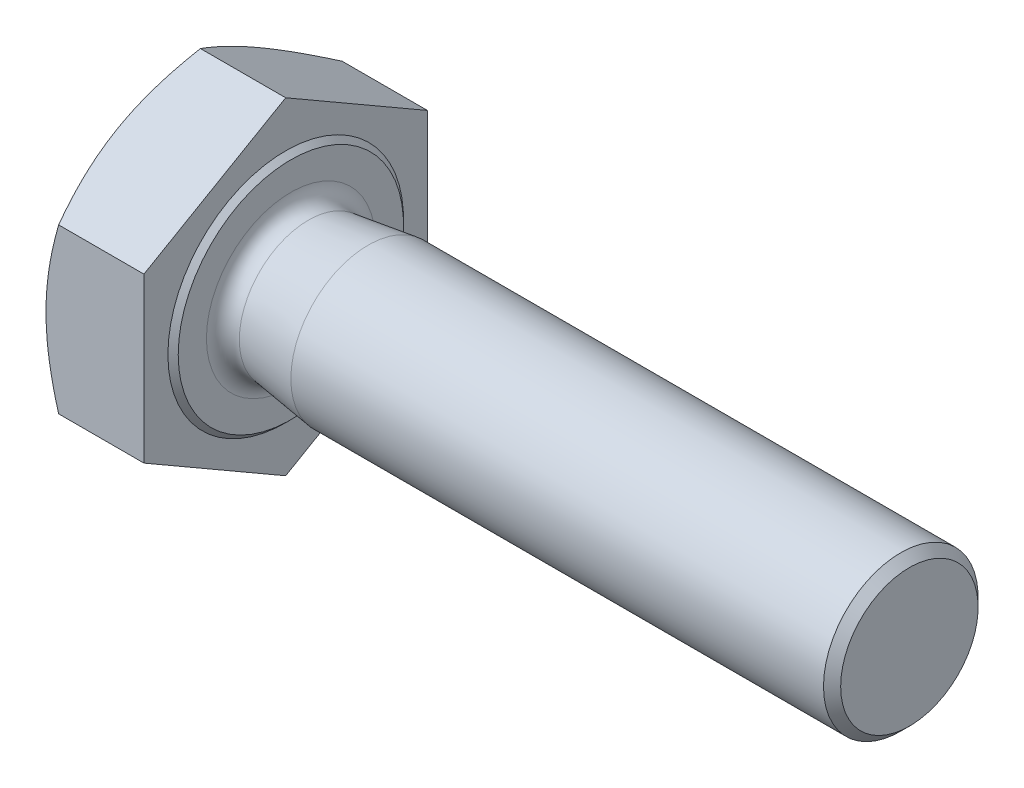
ISO-10303-21;
HEADER;
FILE_DESCRIPTION(('STEP AP214'),'2;1');
FILE_NAME('part.step','',(''),(''),'','','');
FILE_SCHEMA(('AUTOMOTIVE_DESIGN { 1 0 10303 214 1 1 1 1 }'));
ENDSEC;
DATA;
#1=APPLICATION_CONTEXT('core data for automotive mechanical design processes');
#2=APPLICATION_PROTOCOL_DEFINITION('international standard','automotive_design',2000,#1);
#3=PRODUCT_CONTEXT('',#1,'mechanical');
#4=PRODUCT('Part','Part','',(#3));
#5=PRODUCT_RELATED_PRODUCT_CATEGORY('part','',(#4));
#6=PRODUCT_DEFINITION_FORMATION('','',#4);
#7=PRODUCT_DEFINITION_CONTEXT('part definition',#1,'design');
#8=PRODUCT_DEFINITION('design','',#6,#7);
#9=PRODUCT_DEFINITION_SHAPE('','',#8);
#10=(LENGTH_UNIT() NAMED_UNIT(*) SI_UNIT(.MILLI.,.METRE.));
#11=(NAMED_UNIT(*) PLANE_ANGLE_UNIT() SI_UNIT($,.RADIAN.));
#12=(NAMED_UNIT(*) SI_UNIT($,.STERADIAN.) SOLID_ANGLE_UNIT());
#13=UNCERTAINTY_MEASURE_WITH_UNIT(LENGTH_MEASURE(1.E-05),#10,'distance_accuracy_value','');
#14=(GEOMETRIC_REPRESENTATION_CONTEXT(3) GLOBAL_UNCERTAINTY_ASSIGNED_CONTEXT((#13)) GLOBAL_UNIT_ASSIGNED_CONTEXT((#10,
#11,#12)) REPRESENTATION_CONTEXT('',''));
#15=CARTESIAN_POINT('',(0.,0.,0.));
#16=DIRECTION('',(0.,0.,1.));
#17=DIRECTION('',(1.,0.,0.));
#18=AXIS2_PLACEMENT_3D('',#15,#16,#17);
#19=CARTESIAN_POINT('',(2.00000000000001,1.58771324027147,-2.75));
#20=DIRECTION('',(1.,0.,0.));
#21=DIRECTION('',(0.,0.,-1.));
#22=AXIS2_PLACEMENT_3D('',#19,#20,#21);
#23=PLANE('',#22);
#24=CARTESIAN_POINT('',(2.00000000000001,0.,0.));
#25=DIRECTION('',(-1.,0.,0.));
#26=DIRECTION('',(0.,0.,1.));
#27=AXIS2_PLACEMENT_3D('',#24,#25,#26);
#28=CIRCLE('',#27,1.637625);
#29=CARTESIAN_POINT('',(2.00000000000001,0.,1.637625));
#30=VERTEX_POINT('',#29);
#31=EDGE_CURVE('E174',#30,#30,#28,.T.);
#32=ORIENTED_EDGE('',*,*,#31,.T.);
#33=EDGE_LOOP('',(#32));
#34=FACE_BOUND('',#33,.T.);
#35=CARTESIAN_POINT('',(2.00000000000001,0.,0.));
#36=DIRECTION('',(-1.,0.,0.));
#37=DIRECTION('',(0.,0.,1.));
#38=AXIS2_PLACEMENT_3D('',#35,#36,#37);
#39=CIRCLE('',#38,2.185);
#40=CARTESIAN_POINT('',(2.00000000000001,0.,2.185));
#41=VERTEX_POINT('',#40);
#42=EDGE_CURVE('E252',#41,#41,#39,.T.);
#43=ORIENTED_EDGE('',*,*,#42,.F.);
#44=EDGE_LOOP('',(#43));
#45=FACE_BOUND('',#44,.T.);
#46=ADVANCED_FACE('F34',(#34,#45),#23,.T.);
#47=CARTESIAN_POINT('',(3.5,0.,0.));
#48=DIRECTION('',(1.,0.,0.));
#49=DIRECTION('',(0.,0.,-1.));
#50=AXIS2_PLACEMENT_3D('',#47,#48,#49);
#51=CONICAL_SURFACE('',#50,1.5,0.136810520597756);
#52=CARTESIAN_POINT('',(2.34091524101158,0.,0.));
#53=DIRECTION('',(-1.,0.,0.));
#54=DIRECTION('',(0.,0.,1.));
#55=AXIS2_PLACEMENT_3D('',#52,#53,#54);
#56=CIRCLE('',#55,1.3404281913816);
#57=CARTESIAN_POINT('',(2.34091524101158,0.,1.3404281913816));
#58=VERTEX_POINT('',#57);
#59=EDGE_CURVE('E118',#58,#58,#56,.T.);
#60=ORIENTED_EDGE('',*,*,#59,.F.);
#61=EDGE_LOOP('',(#60));
#62=FACE_BOUND('',#61,.T.);
#63=CARTESIAN_POINT('',(3.5,0.,0.));
#64=DIRECTION('',(-1.,0.,0.));
#65=DIRECTION('',(0.,0.,1.));
#66=AXIS2_PLACEMENT_3D('',#63,#64,#65);
#67=CIRCLE('',#66,1.5);
#68=CARTESIAN_POINT('',(3.5,0.,1.5));
#69=VERTEX_POINT('',#68);
#70=EDGE_CURVE('E171',#69,#69,#67,.T.);
#71=ORIENTED_EDGE('',*,*,#70,.T.);
#72=EDGE_LOOP('',(#71));
#73=FACE_BOUND('',#72,.T.);
#74=ADVANCED_FACE('F167',(#62,#73),#51,.T.);
#75=CARTESIAN_POINT('',(2.00000000000001,0.,0.));
#76=DIRECTION('',(-1.,0.,0.));
#77=DIRECTION('',(0.,0.,1.));
#78=AXIS2_PLACEMENT_3D('',#75,#76,#77);
#79=CYLINDRICAL_SURFACE('',#78,1.5);
#80=CARTESIAN_POINT('',(13.8333333333333,0.,0.));
#81=DIRECTION('',(-1.,0.,0.));
#82=DIRECTION('',(0.,0.,1.));
#83=AXIS2_PLACEMENT_3D('',#80,#81,#82);
#84=CIRCLE('',#83,1.5);
#85=CARTESIAN_POINT('',(13.8333333333333,0.,1.5));
#86=VERTEX_POINT('',#85);
#87=EDGE_CURVE('E152',#86,#86,#84,.T.);
#88=ORIENTED_EDGE('',*,*,#87,.T.);
#89=EDGE_LOOP('',(#88));
#90=FACE_BOUND('',#89,.T.);
#91=ORIENTED_EDGE('',*,*,#70,.F.);
#92=EDGE_LOOP('',(#91));
#93=FACE_BOUND('',#92,.T.);
#94=ADVANCED_FACE('F164',(#90,#93),#79,.T.);
#95=CARTESIAN_POINT('',(14.,1.5,0.));
#96=DIRECTION('',(-1.,0.,0.));
#97=DIRECTION('',(0.,0.,1.));
#98=AXIS2_PLACEMENT_3D('',#95,#96,#97);
#99=PLANE('',#98);
#100=CARTESIAN_POINT('',(14.,0.,0.));
#101=DIRECTION('',(-1.,0.,0.));
#102=DIRECTION('',(0.,0.,1.));
#103=AXIS2_PLACEMENT_3D('',#100,#101,#102);
#104=CIRCLE('',#103,1.33333333333333);
#105=CARTESIAN_POINT('',(14.,0.,1.33333333333333));
#106=VERTEX_POINT('',#105);
#107=EDGE_CURVE('E42',#106,#106,#104,.F.);
#108=ORIENTED_EDGE('',*,*,#107,.T.);
#109=EDGE_LOOP('',(#108));
#110=FACE_BOUND('',#109,.T.);
#111=ADVANCED_FACE('F157',(#110),#99,.F.);
#112=CARTESIAN_POINT('',(2.3,0.,0.));
#113=DIRECTION('',(-1.,0.,0.));
#114=DIRECTION('',(0.,0.,1.));
#115=AXIS2_PLACEMENT_3D('',#112,#113,#114);
#116=TOROIDAL_SURFACE('',#115,1.637625,0.299999999999995);
#117=ORIENTED_EDGE('',*,*,#31,.F.);
#118=EDGE_LOOP('',(#117));
#119=FACE_BOUND('',#118,.T.);
#120=ORIENTED_EDGE('',*,*,#59,.T.);
#121=EDGE_LOOP('',(#120));
#122=FACE_BOUND('',#121,.T.);
#123=ADVANCED_FACE('F161',(#119,#122),#116,.F.);
#124=CARTESIAN_POINT('',(13.8333333333333,0.,0.));
#125=DIRECTION('',(-1.,0.,0.));
#126=DIRECTION('',(0.,0.,1.));
#127=AXIS2_PLACEMENT_3D('',#124,#125,#126);
#128=CONICAL_SURFACE('',#127,1.5,0.785398163397443);
#129=ORIENTED_EDGE('',*,*,#107,.F.);
#130=EDGE_LOOP('',(#129));
#131=FACE_BOUND('',#130,.T.);
#132=ORIENTED_EDGE('',*,*,#87,.F.);
#133=EDGE_LOOP('',(#132));
#134=FACE_BOUND('',#133,.T.);
#135=ADVANCED_FACE('F36',(#131,#134),#128,.T.);
#136=CARTESIAN_POINT('',(1.90000000000001,-2.285,0.));
#137=DIRECTION('',(1.,0.,0.));
#138=DIRECTION('',(0.,0.,-1.));
#139=AXIS2_PLACEMENT_3D('',#136,#137,#138);
#140=PLANE('',#139);
#141=CARTESIAN_POINT('',(1.90000000000001,0.,0.));
#142=DIRECTION('',(-1.,0.,0.));
#143=DIRECTION('',(0.,0.,1.));
#144=AXIS2_PLACEMENT_3D('',#141,#142,#143);
#145=CIRCLE('',#144,2.285);
#146=CARTESIAN_POINT('',(1.90000000000001,0.,2.285));
#147=VERTEX_POINT('',#146);
#148=EDGE_CURVE('E254',#147,#147,#145,.T.);
#149=ORIENTED_EDGE('',*,*,#148,.T.);
#150=EDGE_LOOP('',(#149));
#151=FACE_BOUND('',#150,.T.);
#152=DIRECTION('',(0.,1.,0.));
#153=VECTOR('',#152,1.);
#154=CARTESIAN_POINT('',(1.90000000000001,-1.58771324027151,-2.75));
#155=LINE('',#154,#153);
#156=CARTESIAN_POINT('',(1.90000000000001,-1.5877132402715,-2.75));
#157=VERTEX_POINT('',#156);
#158=CARTESIAN_POINT('',(1.90000000000001,1.58771324027147,-2.75));
#159=VERTEX_POINT('',#158);
#160=EDGE_CURVE('E105',#157,#159,#155,.T.);
#161=ORIENTED_EDGE('',*,*,#160,.T.);
#162=DIRECTION('',(0.,0.500000000000002,0.866025403784437));
#163=VECTOR('',#162,1.);
#164=CARTESIAN_POINT('',(1.90000000000001,1.58771324027147,-2.75));
#165=LINE('',#164,#163);
#166=CARTESIAN_POINT('',(1.90000000000001,3.17542648054295,0.));
#167=VERTEX_POINT('',#166);
#168=EDGE_CURVE('E119',#159,#167,#165,.T.);
#169=ORIENTED_EDGE('',*,*,#168,.T.);
#170=DIRECTION('',(0.,-0.499999999999997,0.866025403784441));
#171=VECTOR('',#170,1.);
#172=CARTESIAN_POINT('',(1.90000000000001,3.17542648054295,0.));
#173=LINE('',#172,#171);
#174=CARTESIAN_POINT('',(1.90000000000001,1.58771324027149,2.75));
#175=VERTEX_POINT('',#174);
#176=EDGE_CURVE('E262',#167,#175,#173,.T.);
#177=ORIENTED_EDGE('',*,*,#176,.T.);
#178=DIRECTION('',(0.,-1.,0.));
#179=VECTOR('',#178,1.);
#180=CARTESIAN_POINT('',(1.90000000000001,1.58771324027149,2.75));
#181=LINE('',#180,#179);
#182=CARTESIAN_POINT('',(1.90000000000001,-1.58771324027148,2.75000000000001));
#183=VERTEX_POINT('',#182);
#184=EDGE_CURVE('E260',#175,#183,#181,.T.);
#185=ORIENTED_EDGE('',*,*,#184,.T.);
#186=DIRECTION('',(0.,-0.500000000000001,-0.866025403784438));
#187=VECTOR('',#186,1.);
#188=CARTESIAN_POINT('',(1.90000000000001,-1.58771324027148,2.75000000000001));
#189=LINE('',#188,#187);
#190=CARTESIAN_POINT('',(1.90000000000001,-3.17542648054296,0.));
#191=VERTEX_POINT('',#190);
#192=EDGE_CURVE('E48',#183,#191,#189,.T.);
#193=ORIENTED_EDGE('',*,*,#192,.T.);
#194=DIRECTION('',(0.,0.499999999999998,-0.86602540378444));
#195=VECTOR('',#194,1.);
#196=CARTESIAN_POINT('',(1.90000000000001,-3.17542648054296,0.));
#197=LINE('',#196,#195);
#198=EDGE_CURVE('E11',#191,#157,#197,.T.);
#199=ORIENTED_EDGE('',*,*,#198,.T.);
#200=EDGE_LOOP('',(#161,#169,#177,#185,#193,#199));
#201=FACE_BOUND('',#200,.T.);
#202=ADVANCED_FACE('F104',(#151,#201),#140,.T.);
#203=CARTESIAN_POINT('',(1.90000000000001,0.,0.));
#204=DIRECTION('',(-1.,0.,0.));
#205=DIRECTION('',(0.,0.,1.));
#206=AXIS2_PLACEMENT_3D('',#203,#204,#205);
#207=CONICAL_SURFACE('',#206,2.285,0.785398163397448);
#208=ORIENTED_EDGE('',*,*,#42,.T.);
#209=EDGE_LOOP('',(#208));
#210=FACE_BOUND('',#209,.T.);
#211=ORIENTED_EDGE('',*,*,#148,.F.);
#212=EDGE_LOOP('',(#211));
#213=FACE_BOUND('',#212,.T.);
#214=ADVANCED_FACE('F277',(#210,#213),#207,.T.);
#215=CARTESIAN_POINT('',(0.,1.58771324027147,-2.75));
#216=DIRECTION('',(1.,0.,0.));
#217=DIRECTION('',(0.,0.,-1.));
#218=AXIS2_PLACEMENT_3D('',#215,#216,#217);
#219=PLANE('',#218);
#220=CARTESIAN_POINT('',(0.,0.,0.));
#221=DIRECTION('',(1.,0.,0.));
#222=DIRECTION('',(0.,0.,-1.));
#223=AXIS2_PLACEMENT_3D('',#220,#221,#222);
#224=CIRCLE('',#223,2.75);
#225=CARTESIAN_POINT('',(0.,0.,-2.75));
#226=VERTEX_POINT('',#225);
#227=CARTESIAN_POINT('',(0.,2.3815698604072,-1.37500000000001));
#228=VERTEX_POINT('',#227);
#229=EDGE_CURVE('E151',#226,#228,#224,.T.);
#230=ORIENTED_EDGE('',*,*,#229,.F.);
#231=CARTESIAN_POINT('',(0.,-2.38156986040723,-1.37500000000001));
#232=VERTEX_POINT('',#231);
#233=EDGE_CURVE('E147',#232,#226,#224,.T.);
#234=ORIENTED_EDGE('',*,*,#233,.F.);
#235=CARTESIAN_POINT('',(0.,-2.38156986040721,1.375));
#236=VERTEX_POINT('',#235);
#237=EDGE_CURVE('E150',#236,#232,#224,.T.);
#238=ORIENTED_EDGE('',*,*,#237,.F.);
#239=CARTESIAN_POINT('',(0.,0.,2.75));
#240=VERTEX_POINT('',#239);
#241=EDGE_CURVE('E318',#240,#236,#224,.T.);
#242=ORIENTED_EDGE('',*,*,#241,.F.);
#243=CARTESIAN_POINT('',(0.,0.,0.));
#244=DIRECTION('',(-1.,0.,0.));
#245=DIRECTION('',(0.,0.,1.));
#246=AXIS2_PLACEMENT_3D('',#243,#244,#245);
#247=CIRCLE('',#246,2.75);
#248=CARTESIAN_POINT('',(0.,2.38156986040721,1.37499999999999));
#249=VERTEX_POINT('',#248);
#250=EDGE_CURVE('E173',#240,#249,#247,.T.);
#251=ORIENTED_EDGE('',*,*,#250,.T.);
#252=EDGE_CURVE('E295',#228,#249,#224,.T.);
#253=ORIENTED_EDGE('',*,*,#252,.F.);
#254=EDGE_LOOP('',(#230,#234,#238,#242,#251,#253));
#255=FACE_BOUND('',#254,.T.);
#256=ADVANCED_FACE('F280',(#255),#219,.F.);
#257=CARTESIAN_POINT('',(0.,0.,0.));
#258=DIRECTION('',(1.,0.,0.));
#259=DIRECTION('',(0.,0.,1.));
#260=AXIS2_PLACEMENT_3D('',#257,#258,#259);
#261=CONICAL_SURFACE('',#260,2.75,1.0471975511966);
#262=CARTESIAN_POINT('',(0.245686763364765,3.17554195059679,0.000199999999996788));
#263=CARTESIAN_POINT('',(0.205387662249268,3.10576962051744,-0.120649220659909));
#264=CARTESIAN_POINT('',(0.168736902597667,3.03539502097909,-0.242541602622638));
#265=CARTESIAN_POINT('',(0.104762182969805,2.8934271739444,-0.488437126727897));
#266=CARTESIAN_POINT('',(0.0774608556745015,2.82183140359859,-0.61244463857386));
#267=CARTESIAN_POINT('',(0.0349617452941205,2.67952717191843,-0.858922797975949));
#268=CARTESIAN_POINT('',(0.0194811186224612,2.60884060771578,-0.981355518587423));
#269=CARTESIAN_POINT('',(0.000999397369943601,2.46713482015519,-1.22679714236892));
#270=CARTESIAN_POINT('',(-0.0020170005373972,2.39611611197038,-1.34980515323292));
#271=CARTESIAN_POINT('',(0.00425314542854959,2.26341005486545,-1.5796587866108));
#272=CARTESIAN_POINT('',(0.0120001542767051,2.20170285541369,-1.68653879125403));
#273=CARTESIAN_POINT('',(0.036555181064357,2.07869048467395,-1.89960246733476));
#274=CARTESIAN_POINT('',(0.0533715896505722,2.01738573896434,-2.00578540164889));
#275=CARTESIAN_POINT('',(0.0954119223459576,1.89411967378235,-2.21928848939319));
#276=CARTESIAN_POINT('',(0.120814080687232,1.83217395817123,-2.32658161614286));
#277=CARTESIAN_POINT('',(0.178467225839982,1.70920651275308,-2.53956747928406));
#278=CARTESIAN_POINT('',(0.210704663298983,1.64818320715446,-2.64526294502666));
#279=CARTESIAN_POINT('',(0.24568676336476,1.58759777021764,-2.7502));
#280=B_SPLINE_CURVE_WITH_KNOTS('',3,(#262,#263,#264,#265,#266,#267,#268,#269,#270,#271,#272,
#273,#274,#275,#276,#277,#278,#279),.UNSPECIFIED.,.F.,.F.,(4,2,2,2,2,2,2,2,4),(0.,
0.43591282872589,0.872873557116336,1.29901931904672,1.72464171213574,2.09526089052938,
2.46622354066375,2.84541551798558,3.22386274754525),.UNSPECIFIED.);
#281=CARTESIAN_POINT('',(0.245620093061862,1.58771324027147,-2.75));
#282=VERTEX_POINT('',#281);
#283=EDGE_CURVE('E225',#228,#282,#280,.T.);
#284=ORIENTED_EDGE('',*,*,#283,.T.);
#285=CARTESIAN_POINT('',(1.31624212326251,-4.21145702342949,-2.74999999999999));
#286=CARTESIAN_POINT('',(1.25788881046744,-4.09071174042553,-2.74999999999999));
#287=CARTESIAN_POINT('',(1.20011539171992,-3.96968104448539,-2.74999999999999));
#288=CARTESIAN_POINT('',(1.08605969966697,-3.7268945072172,-2.74999999999999));
#289=CARTESIAN_POINT('',(1.02977768439379,-3.60513854481436,-2.74999999999999));
#290=CARTESIAN_POINT('',(0.91873979244787,-3.3600897390939,-2.74999999999999));
#291=CARTESIAN_POINT('',(0.863994486657983,-3.23679208848354,-2.74999999999999));
#292=CARTESIAN_POINT('',(0.756854443318355,-2.98918361342532,-2.74999999999999));
#293=CARTESIAN_POINT('',(0.704459583295894,-2.86487284216706,-2.74999999999999));
#294=CARTESIAN_POINT('',(0.602022235339522,-2.6134943668471,-2.74999999999999));
#295=CARTESIAN_POINT('',(0.55201660745802,-2.48641155941057,-2.74999999999999));
#296=CARTESIAN_POINT('',(0.455920265276003,-2.23074720807679,-2.74999999999999));
#297=CARTESIAN_POINT('',(0.409829986462912,-2.10216549926727,-2.74999999999999));
#298=CARTESIAN_POINT('',(0.322802331663269,-1.84356266872548,-2.75));
#299=CARTESIAN_POINT('',(0.281854005910036,-1.71354526995044,-2.75));
#300=CARTESIAN_POINT('',(0.206439732743099,-1.45166207558676,-2.75));
#301=CARTESIAN_POINT('',(0.171971735991313,-1.31979687856831,-2.75));
#302=CARTESIAN_POINT('',(0.111191121809896,-1.05412827285572,-2.75));
#303=CARTESIAN_POINT('',(0.0848806435176731,-0.920324365387682,-2.75));
#304=CARTESIAN_POINT('',(0.0421860185817315,-0.651102654150332,-2.75));
#305=CARTESIAN_POINT('',(0.0258018800461315,-0.515684849062829,-2.75));
#306=CARTESIAN_POINT('',(0.00440934209633706,-0.244802002252751,-2.75));
#307=CARTESIAN_POINT('',(-0.000671138197587251,-0.109342801148255,-2.75));
#308=CARTESIAN_POINT('',(0.000813817391959725,0.16148175402296,-2.75));
#309=CARTESIAN_POINT('',(0.00737622709449395,0.296847123330022,-2.75));
#310=CARTESIAN_POINT('',(0.0280606058300816,0.52798398747936,-2.75));
#311=CARTESIAN_POINT('',(0.0394847950613384,0.624010438507003,-2.75));
#312=CARTESIAN_POINT('',(0.0674495513434205,0.815321973782276,-2.75));
#313=CARTESIAN_POINT('',(0.0839909247880751,0.910606938754643,-2.75));
#314=CARTESIAN_POINT('',(0.140422744319285,1.19527171090509,-2.75));
#315=CARTESIAN_POINT('',(0.18710637361392,1.38331767236712,-2.75));
#316=CARTESIAN_POINT('',(0.267628179855785,1.66470103563901,-2.75));
#317=CARTESIAN_POINT('',(0.296628866845756,1.7595050183921,-2.75));
#318=CARTESIAN_POINT('',(0.357501164220875,1.9481235007387,-2.75));
#319=CARTESIAN_POINT('',(0.389370794921845,2.04193863349427,-2.75));
#320=CARTESIAN_POINT('',(0.455317725722647,2.22818711914583,-2.75));
#321=CARTESIAN_POINT('',(0.489381592159885,2.32062527709228,-2.75));
#322=CARTESIAN_POINT('',(0.559509524426167,2.50478428633537,-2.75));
#323=CARTESIAN_POINT('',(0.595574398155265,2.59650483059226,-2.75));
#324=CARTESIAN_POINT('',(0.632442341458888,2.68789367744809,-2.75));
#325=B_SPLINE_CURVE_WITH_KNOTS('',3,(#285,#286,#287,#288,#289,#290,#291,#292,#293,#294,#295,
#296,#297,#298,#299,#300,#301,#302,#303,#304,#305,#306,#307,#308,#309,#310,#311,#312,#313,#314,
#315,#316,#317,#318,#319,#320,#321,#322,#323,#324),.UNSPECIFIED.,.F.,.F.,(4,2,2,2,2,2,2,2,2,2,2,
2,2,2,2,2,2,2,2,4),(0.,0.402324664004668,0.804718486862624,1.20941398617469,1.61408837380394,
2.0237401516388,2.43343743378258,2.84224691340594,3.25092689293203,3.65971394971315,
4.06850134040281,4.47467442318479,4.88074195028635,5.17071124524431,5.46072625844401,
6.04118769843149,6.3385855190861,6.63577967395433,6.93130128400769,7.2269430906841),.UNSPECIFIED.);
#326=EDGE_CURVE('E297',#282,#226,#325,.F.);
#327=ORIENTED_EDGE('',*,*,#326,.T.);
#328=ORIENTED_EDGE('',*,*,#229,.T.);
#329=EDGE_LOOP('',(#284,#327,#328));
#330=FACE_BOUND('',#329,.T.);
#331=ADVANCED_FACE('F284',(#330),#261,.T.);
#332=CARTESIAN_POINT('',(0.245686763364766,1.58759777021766,2.7502));
#333=CARTESIAN_POINT('',(0.205387662249269,1.65737010029701,2.6293507793401));
#334=CARTESIAN_POINT('',(0.168736902597668,1.72774469983535,2.50745839737737));
#335=CARTESIAN_POINT('',(0.104762182969807,1.86971254687005,2.26156287327211));
#336=CARTESIAN_POINT('',(0.0774608556745038,1.94130831721585,2.13755536142614));
#337=CARTESIAN_POINT('',(0.0349617452941234,2.08361254889601,1.89107720202405));
#338=CARTESIAN_POINT('',(0.0194811186224643,2.15429911309866,1.76864448141258));
#339=CARTESIAN_POINT('',(0.000999397369947196,2.29600490065925,1.52320285763108));
#340=CARTESIAN_POINT('',(-0.00201700053739325,2.36702360884406,1.40019484676708));
#341=CARTESIAN_POINT('',(0.00425314542855422,2.49972966594899,1.1703412133892));
#342=CARTESIAN_POINT('',(0.01200015427671,2.56143686540075,1.06346120874597));
#343=CARTESIAN_POINT('',(0.0365551810643623,2.68444923614048,0.850397532665244));
#344=CARTESIAN_POINT('',(0.0533715896505777,2.7457539818501,0.744214598351105));
#345=CARTESIAN_POINT('',(0.0954119223459633,2.86902004703208,0.530711510606811));
#346=CARTESIAN_POINT('',(0.120814080687238,2.9309657626432,0.42341838385714));
#347=CARTESIAN_POINT('',(0.178467225839988,3.05393320806135,0.210432520715945));
#348=CARTESIAN_POINT('',(0.210704663298988,3.11495651365996,0.104737054973343));
#349=CARTESIAN_POINT('',(0.245686763364765,3.17554195059679,-0.000200000000003531));
#350=B_SPLINE_CURVE_WITH_KNOTS('',3,(#332,#333,#334,#335,#336,#337,#338,#339,#340,#341,#342,
#343,#344,#345,#346,#347,#348,#349),.UNSPECIFIED.,.F.,.F.,(4,2,2,2,2,2,2,2,4),(0.,
0.43591282872589,0.872873557116336,1.29901931904672,1.72464171213574,2.09526089052938,
2.46622354066375,2.84541551798557,3.22386274754524),.UNSPECIFIED.);
#351=CARTESIAN_POINT('',(0.245620093061867,3.17542648054295,0.));
#352=VERTEX_POINT('',#351);
#353=EDGE_CURVE('E131',#249,#352,#350,.T.);
#354=ORIENTED_EDGE('',*,*,#353,.T.);
#355=EDGE_CURVE('E56',#352,#228,#280,.T.);
#356=ORIENTED_EDGE('',*,*,#355,.T.);
#357=ORIENTED_EDGE('',*,*,#252,.T.);
#358=EDGE_LOOP('',(#354,#356,#357));
#359=FACE_BOUND('',#358,.T.);
#360=ADVANCED_FACE('F205',(#359),#261,.T.);
#361=CARTESIAN_POINT('',(0.245620093061868,1.58771324027149,2.75));
#362=VERTEX_POINT('',#361);
#363=EDGE_CURVE('E127',#362,#249,#350,.T.);
#364=ORIENTED_EDGE('',*,*,#363,.T.);
#365=ORIENTED_EDGE('',*,*,#250,.F.);
#366=CARTESIAN_POINT('',(1.31624249788294,-4.21145779837337,2.75000000000002));
#367=CARTESIAN_POINT('',(1.25788916905969,-4.09071248884133,2.75000000000001));
#368=CARTESIAN_POINT('',(1.20011573429342,-3.96968176635284,2.75000000000001));
#369=CARTESIAN_POINT('',(1.08606001028829,-3.72689517589921,2.75000000000001));
#370=CARTESIAN_POINT('',(1.02977797908169,-3.60513918685926,2.75000000000001));
#371=CARTESIAN_POINT('',(0.918740055260961,-3.36009032741943,2.75000000000001));
#372=CARTESIAN_POINT('',(0.863994733533081,-3.23679264972493,2.75000000000001));
#373=CARTESIAN_POINT('',(0.756854658610672,-2.98918412029702,2.75000000000001));
#374=CARTESIAN_POINT('',(0.704459782943393,-2.86487332175325,2.75000000000001));
#375=CARTESIAN_POINT('',(0.602022403965373,-2.61349479112549,2.75000000000001));
#376=CARTESIAN_POINT('',(0.552016760715457,-2.48641195566195,2.75000000000001));
#377=CARTESIAN_POINT('',(0.455920388648755,-2.23074754780518,2.75000000000001));
#378=CARTESIAN_POINT('',(0.409830095319694,-2.10216581049953,2.75000000000001));
#379=CARTESIAN_POINT('',(0.322802412932949,-1.84356292242721,2.75000000000001));
#380=CARTESIAN_POINT('',(0.281854074103877,-1.71354549461973,2.75000000000001));
#381=CARTESIAN_POINT('',(0.206439776997205,-1.45166224139211,2.75000000000001));
#382=CARTESIAN_POINT('',(0.171971769380086,-1.31979701454263,2.75000000000001));
#383=CARTESIAN_POINT('',(0.111191133215989,-1.05412833266647,2.75000000000001));
#384=CARTESIAN_POINT('',(0.0848806447633858,-0.920324378642731,2.75000000000001));
#385=CARTESIAN_POINT('',(0.0421860066064337,-0.651102573247699,2.75000000000001));
#386=CARTESIAN_POINT('',(0.0258018650051084,-0.515684720559049,2.75000000000001));
#387=CARTESIAN_POINT('',(0.00440932930341746,-0.244801778776636,2.75000000000001));
#388=CARTESIAN_POINT('',(-0.000671145746831288,-0.109342530304086,2.75000000000001));
#389=CARTESIAN_POINT('',(0.000813828419927892,0.161482118797624,2.75000000000001));
#390=CARTESIAN_POINT('',(0.00737625145778912,0.296847534667326,2.75000000000001));
#391=CARTESIAN_POINT('',(0.0280606568921305,0.527984458346977,2.75));
#392=CARTESIAN_POINT('',(0.0394848568087034,0.624010922860067,2.75));
#393=CARTESIAN_POINT('',(0.0674496350497989,0.815322484539504,2.75));
#394=CARTESIAN_POINT('',(0.0839910197682492,0.910607462430497,2.75));
#395=CARTESIAN_POINT('',(0.140422873394751,1.19527227271464,2.75));
#396=CARTESIAN_POINT('',(0.187106525762279,1.38331825868885,2.75));
#397=CARTESIAN_POINT('',(0.267628366134444,1.66470165859646,2.75));
#398=CARTESIAN_POINT('',(0.296629064583484,1.75950565376436,2.75));
#399=CARTESIAN_POINT('',(0.357501384545932,1.94812416079951,2.75));
#400=CARTESIAN_POINT('',(0.38937102637501,2.04193930582903,2.75));
#401=CARTESIAN_POINT('',(0.45531797899608,2.2281878158503,2.75));
#402=CARTESIAN_POINT('',(0.489381856125789,2.32062598589335,2.75));
#403=CARTESIAN_POINT('',(0.559509809454751,2.50478501935609,2.75));
#404=CARTESIAN_POINT('',(0.5955746935544,2.59650557573584,2.75));
#405=CARTESIAN_POINT('',(0.632442647069142,2.68789443473504,2.75));
#406=B_SPLINE_CURVE_WITH_KNOTS('',3,(#366,#367,#368,#369,#370,#371,#372,#373,#374,#375,#376,
#377,#378,#379,#380,#381,#382,#383,#384,#385,#386,#387,#388,#389,#390,#391,#392,#393,#394,#395,
#396,#397,#398,#399,#400,#401,#402,#403,#404,#405),.UNSPECIFIED.,.F.,.F.,(4,2,2,2,2,2,2,2,2,2,2,
2,2,2,2,2,2,2,2,4),(0.,0.402324756583367,0.804718672035376,1.20941426501205,1.61408874629842,
2.02374061924835,2.43343799653934,2.84224757096772,3.25092764522196,3.65971484460846,
4.06850237769354,4.47467560134931,4.88074326942386,5.1707126083325,5.46072766549014,
6.04118919364032,6.33858705998218,6.63578126046827,6.93130291567529,7.22694476759461),.UNSPECIFIED.);
#407=EDGE_CURVE('E308',#240,#362,#406,.T.);
#408=ORIENTED_EDGE('',*,*,#407,.T.);
#409=EDGE_LOOP('',(#364,#365,#408));
#410=FACE_BOUND('',#409,.T.);
#411=ADVANCED_FACE('F199',(#410),#261,.T.);
#412=CARTESIAN_POINT('',(0.245620093061867,-1.58771324027148,2.75000000000001));
#413=VERTEX_POINT('',#412);
#414=EDGE_CURVE('E219',#413,#240,#406,.T.);
#415=ORIENTED_EDGE('',*,*,#414,.T.);
#416=ORIENTED_EDGE('',*,*,#241,.T.);
#417=CARTESIAN_POINT('',(0.245686763364769,-3.1755419505968,-0.000200000000003556));
#418=CARTESIAN_POINT('',(0.205387662249272,-3.10576962051744,0.120649220659903));
#419=CARTESIAN_POINT('',(0.16873690259767,-3.0353950209791,0.242541602622631));
#420=CARTESIAN_POINT('',(0.104762182969809,-2.8934271739444,0.488437126727892));
#421=CARTESIAN_POINT('',(0.0774608556745052,-2.8218314035986,0.612444638573855));
#422=CARTESIAN_POINT('',(0.0349617452941242,-2.67952717191844,0.858922797975945));
#423=CARTESIAN_POINT('',(0.0194811186224649,-2.60884060771579,0.98135551858742));
#424=CARTESIAN_POINT('',(0.000999397369947164,-2.4671348201552,1.22679714236892));
#425=CARTESIAN_POINT('',(-0.00201700053739374,-2.39611611197039,1.34980515323292));
#426=CARTESIAN_POINT('',(0.00425314542855302,-2.26341005486546,1.5796587866108));
#427=CARTESIAN_POINT('',(0.0120001542767086,-2.2017028554137,1.68653879125403));
#428=CARTESIAN_POINT('',(0.0365551810643607,-2.07869048467396,1.89960246733476));
#429=CARTESIAN_POINT('',(0.053371589650576,-2.01738573896435,2.0057854016489));
#430=CARTESIAN_POINT('',(0.0954119223459618,-1.89411967378236,2.21928848939319));
#431=CARTESIAN_POINT('',(0.120814080687236,-1.83217395817124,2.32658161614286));
#432=CARTESIAN_POINT('',(0.178467225839987,-1.70920651275309,2.53956747928406));
#433=CARTESIAN_POINT('',(0.210704663298988,-1.64818320715447,2.64526294502666));
#434=CARTESIAN_POINT('',(0.245686763364765,-1.58759777021764,2.75020000000001));
#435=B_SPLINE_CURVE_WITH_KNOTS('',3,(#417,#418,#419,#420,#421,#422,#423,#424,#425,#426,#427,
#428,#429,#430,#431,#432,#433,#434),.UNSPECIFIED.,.F.,.F.,(4,2,2,2,2,2,2,2,4),(0.,
0.435912828725891,0.872873557116337,1.29901931904672,1.72464171213575,2.09526089052939,
2.46622354066376,2.84541551798559,3.22386274754526),.UNSPECIFIED.);
#436=EDGE_CURVE('E299',#236,#413,#435,.T.);
#437=ORIENTED_EDGE('',*,*,#436,.T.);
#438=EDGE_LOOP('',(#415,#416,#437));
#439=FACE_BOUND('',#438,.T.);
#440=ADVANCED_FACE('F204',(#439),#261,.T.);
#441=CARTESIAN_POINT('',(0.245620093061867,-1.5877132402715,-2.75));
#442=VERTEX_POINT('',#441);
#443=EDGE_CURVE('E213',#226,#442,#325,.F.);
#444=ORIENTED_EDGE('',*,*,#443,.T.);
#445=CARTESIAN_POINT('',(0.245686763364766,-1.58759777021767,-2.7502));
#446=CARTESIAN_POINT('',(0.205387662249269,-1.65737010029702,-2.62935077934009));
#447=CARTESIAN_POINT('',(0.168736902597668,-1.72774469983537,-2.50745839737736));
#448=CARTESIAN_POINT('',(0.104762182969808,-1.86971254687006,-2.2615628732721));
#449=CARTESIAN_POINT('',(0.0774608556745052,-1.94130831721586,-2.13755536142614));
#450=CARTESIAN_POINT('',(0.0349617452941258,-2.08361254889602,-1.89107720202405));
#451=CARTESIAN_POINT('',(0.0194811186224672,-2.15429911309868,-1.76864448141257));
#452=CARTESIAN_POINT('',(0.000999397369951112,-2.29600490065926,-1.52320285763107));
#453=CARTESIAN_POINT('',(-0.00201700053738893,-2.36702360884407,-1.40019484676707));
#454=CARTESIAN_POINT('',(0.00425314542855934,-2.499729665949,-1.17034121338919));
#455=CARTESIAN_POINT('',(0.0120001542767154,-2.56143686540076,-1.06346120874597));
#456=CARTESIAN_POINT('',(0.036555181064368,-2.6844492361405,-0.850397532665242));
#457=CARTESIAN_POINT('',(0.0533715896505833,-2.74575398185011,-0.744214598351104));
#458=CARTESIAN_POINT('',(0.0954119223459687,-2.86902004703209,-0.530711510606812));
#459=CARTESIAN_POINT('',(0.120814080687243,-2.93096576264321,-0.423418383857142));
#460=CARTESIAN_POINT('',(0.178467225839993,-3.05393320806136,-0.210432520715949));
#461=CARTESIAN_POINT('',(0.210704663298993,-3.11495651365997,-0.10473705497335));
#462=CARTESIAN_POINT('',(0.245686763364769,-3.1755419505968,0.000199999999996382));
#463=B_SPLINE_CURVE_WITH_KNOTS('',3,(#445,#446,#447,#448,#449,#450,#451,#452,#453,#454,#455,
#456,#457,#458,#459,#460,#461,#462),.UNSPECIFIED.,.F.,.F.,(4,2,2,2,2,2,2,2,4),(0.,
0.43591282872589,0.872873557116336,1.29901931904672,1.72464171213574,2.09526089052938,
2.46622354066374,2.84541551798556,3.22386274754523),.UNSPECIFIED.);
#464=EDGE_CURVE('E125',#442,#232,#463,.T.);
#465=ORIENTED_EDGE('',*,*,#464,.T.);
#466=ORIENTED_EDGE('',*,*,#233,.T.);
#467=EDGE_LOOP('',(#444,#465,#466));
#468=FACE_BOUND('',#467,.T.);
#469=ADVANCED_FACE('F316',(#468),#261,.T.);
#470=CARTESIAN_POINT('',(0.245620093061871,-3.17542648054296,0.));
#471=VERTEX_POINT('',#470);
#472=EDGE_CURVE('E190',#471,#236,#435,.T.);
#473=ORIENTED_EDGE('',*,*,#472,.T.);
#474=ORIENTED_EDGE('',*,*,#237,.T.);
#475=EDGE_CURVE('E177',#232,#471,#463,.T.);
#476=ORIENTED_EDGE('',*,*,#475,.T.);
#477=EDGE_LOOP('',(#473,#474,#476));
#478=FACE_BOUND('',#477,.T.);
#479=ADVANCED_FACE('F207',(#478),#261,.T.);
#480=CARTESIAN_POINT('',(2.00000000000001,-3.17542648054296,0.));
#481=DIRECTION('',(0.,0.86602540378444,0.499999999999998));
#482=DIRECTION('',(0.,-0.499999999999998,0.86602540378444));
#483=AXIS2_PLACEMENT_3D('',#480,#481,#482);
#484=PLANE('',#483);
#485=ORIENTED_EDGE('',*,*,#198,.F.);
#486=DIRECTION('',(-1.,0.,0.));
#487=VECTOR('',#486,1.);
#488=CARTESIAN_POINT('',(2.00000000000001,-3.17542648054296,0.));
#489=LINE('',#488,#487);
#490=EDGE_CURVE('E126',#191,#471,#489,.T.);
#491=ORIENTED_EDGE('',*,*,#490,.T.);
#492=ORIENTED_EDGE('',*,*,#475,.F.);
#493=ORIENTED_EDGE('',*,*,#464,.F.);
#494=DIRECTION('',(-1.,0.,0.));
#495=VECTOR('',#494,1.);
#496=CARTESIAN_POINT('',(2.00000000000001,-1.58771324027151,-2.75));
#497=LINE('',#496,#495);
#498=EDGE_CURVE('E114',#157,#442,#497,.T.);
#499=ORIENTED_EDGE('',*,*,#498,.F.);
#500=EDGE_LOOP('',(#485,#491,#492,#493,#499));
#501=FACE_BOUND('',#500,.T.);
#502=ADVANCED_FACE('F122',(#501),#484,.F.);
#503=CARTESIAN_POINT('',(2.00000000000001,-1.58771324027148,2.75000000000001));
#504=DIRECTION('',(0.,0.866025403784438,-0.500000000000001));
#505=DIRECTION('',(0.,0.500000000000001,0.866025403784438));
#506=AXIS2_PLACEMENT_3D('',#503,#504,#505);
#507=PLANE('',#506);
#508=ORIENTED_EDGE('',*,*,#192,.F.);
#509=DIRECTION('',(-1.,0.,0.));
#510=VECTOR('',#509,1.);
#511=CARTESIAN_POINT('',(2.00000000000001,-1.58771324027148,2.75000000000001));
#512=LINE('',#511,#510);
#513=EDGE_CURVE('E129',#183,#413,#512,.T.);
#514=ORIENTED_EDGE('',*,*,#513,.T.);
#515=ORIENTED_EDGE('',*,*,#436,.F.);
#516=ORIENTED_EDGE('',*,*,#472,.F.);
#517=ORIENTED_EDGE('',*,*,#490,.F.);
#518=EDGE_LOOP('',(#508,#514,#515,#516,#517));
#519=FACE_BOUND('',#518,.T.);
#520=ADVANCED_FACE('F320',(#519),#507,.F.);
#521=CARTESIAN_POINT('',(2.00000000000001,1.58771324027149,2.75));
#522=DIRECTION('',(0.,0.,-1.));
#523=DIRECTION('',(0.,1.,0.));
#524=AXIS2_PLACEMENT_3D('',#521,#522,#523);
#525=PLANE('',#524);
#526=ORIENTED_EDGE('',*,*,#184,.F.);
#527=DIRECTION('',(-1.,0.,0.));
#528=VECTOR('',#527,1.);
#529=CARTESIAN_POINT('',(2.00000000000001,1.58771324027149,2.75));
#530=LINE('',#529,#528);
#531=EDGE_CURVE('E142',#175,#362,#530,.T.);
#532=ORIENTED_EDGE('',*,*,#531,.T.);
#533=ORIENTED_EDGE('',*,*,#407,.F.);
#534=ORIENTED_EDGE('',*,*,#414,.F.);
#535=ORIENTED_EDGE('',*,*,#513,.F.);
#536=EDGE_LOOP('',(#526,#532,#533,#534,#535));
#537=FACE_BOUND('',#536,.T.);
#538=ADVANCED_FACE('F324',(#537),#525,.F.);
#539=CARTESIAN_POINT('',(2.00000000000001,3.17542648054295,0.));
#540=DIRECTION('',(0.,-0.866025403784441,-0.499999999999997));
#541=DIRECTION('',(0.,0.499999999999997,-0.866025403784441));
#542=AXIS2_PLACEMENT_3D('',#539,#540,#541);
#543=PLANE('',#542);
#544=ORIENTED_EDGE('',*,*,#176,.F.);
#545=DIRECTION('',(-1.,0.,0.));
#546=VECTOR('',#545,1.);
#547=CARTESIAN_POINT('',(2.00000000000001,3.17542648054295,0.));
#548=LINE('',#547,#546);
#549=EDGE_CURVE('E144',#167,#352,#548,.T.);
#550=ORIENTED_EDGE('',*,*,#549,.T.);
#551=ORIENTED_EDGE('',*,*,#353,.F.);
#552=ORIENTED_EDGE('',*,*,#363,.F.);
#553=ORIENTED_EDGE('',*,*,#531,.F.);
#554=EDGE_LOOP('',(#544,#550,#551,#552,#553));
#555=FACE_BOUND('',#554,.T.);
#556=ADVANCED_FACE('F235',(#555),#543,.F.);
#557=CARTESIAN_POINT('',(2.00000000000001,1.58771324027147,-2.75));
#558=DIRECTION('',(0.,-0.866025403784437,0.500000000000003));
#559=DIRECTION('',(0.,-0.500000000000002,-0.866025403784437));
#560=AXIS2_PLACEMENT_3D('',#557,#558,#559);
#561=PLANE('',#560);
#562=ORIENTED_EDGE('',*,*,#168,.F.);
#563=DIRECTION('',(-1.,0.,0.));
#564=VECTOR('',#563,1.);
#565=CARTESIAN_POINT('',(2.00000000000001,1.58771324027147,-2.75));
#566=LINE('',#565,#564);
#567=EDGE_CURVE('E117',#159,#282,#566,.T.);
#568=ORIENTED_EDGE('',*,*,#567,.T.);
#569=ORIENTED_EDGE('',*,*,#283,.F.);
#570=ORIENTED_EDGE('',*,*,#355,.F.);
#571=ORIENTED_EDGE('',*,*,#549,.F.);
#572=EDGE_LOOP('',(#562,#568,#569,#570,#571));
#573=FACE_BOUND('',#572,.T.);
#574=ADVANCED_FACE('F232',(#573),#561,.F.);
#575=CARTESIAN_POINT('',(2.00000000000001,-1.58771324027151,-2.75));
#576=DIRECTION('',(0.,0.,1.));
#577=DIRECTION('',(0.,-1.,0.));
#578=AXIS2_PLACEMENT_3D('',#575,#576,#577);
#579=PLANE('',#578);
#580=ORIENTED_EDGE('',*,*,#160,.F.);
#581=ORIENTED_EDGE('',*,*,#498,.T.);
#582=ORIENTED_EDGE('',*,*,#443,.F.);
#583=ORIENTED_EDGE('',*,*,#326,.F.);
#584=ORIENTED_EDGE('',*,*,#567,.F.);
#585=EDGE_LOOP('',(#580,#581,#582,#583,#584));
#586=FACE_BOUND('',#585,.T.);
#587=ADVANCED_FACE('F112',(#586),#579,.F.);
#588=CLOSED_SHELL('',(#46,#74,#94,#111,#123,#135,#202,#214,#256,#331,#360,#411,#440,#469,#479,
#502,#520,#538,#556,#574,#587));
#589=MANIFOLD_SOLID_BREP('B2',#588);
#590=ADVANCED_BREP_SHAPE_REPRESENTATION('',(#18,#589),#14);
#591=SHAPE_DEFINITION_REPRESENTATION(#9,#590);
ENDSEC;
END-ISO-10303-21;
